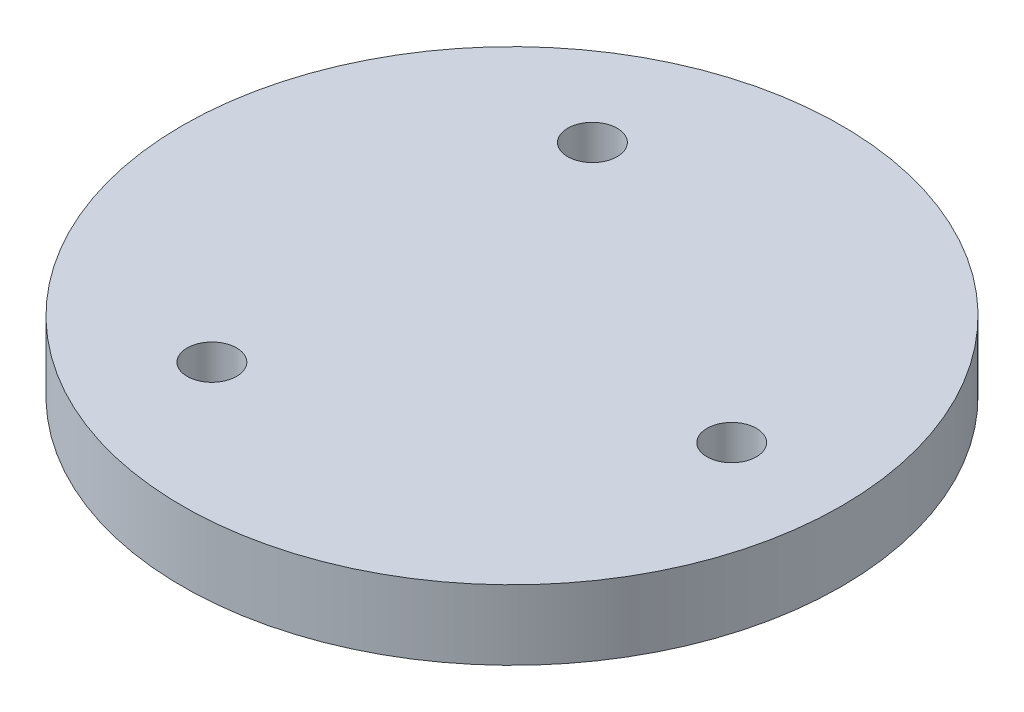
ISO-10303-21;
HEADER;
FILE_DESCRIPTION(('STEP AP214'),'2;1');
FILE_NAME('part.step','',(''),(''),'','','');
FILE_SCHEMA(('AUTOMOTIVE_DESIGN { 1 0 10303 214 1 1 1 1 }'));
ENDSEC;
DATA;
#1=APPLICATION_CONTEXT('core data for automotive mechanical design processes');
#2=APPLICATION_PROTOCOL_DEFINITION('international standard','automotive_design',2000,#1);
#3=PRODUCT_CONTEXT('',#1,'mechanical');
#4=PRODUCT('Part','Part','',(#3));
#5=PRODUCT_RELATED_PRODUCT_CATEGORY('part','',(#4));
#6=PRODUCT_DEFINITION_FORMATION('','',#4);
#7=PRODUCT_DEFINITION_CONTEXT('part definition',#1,'design');
#8=PRODUCT_DEFINITION('design','',#6,#7);
#9=PRODUCT_DEFINITION_SHAPE('','',#8);
#10=(LENGTH_UNIT() NAMED_UNIT(*) SI_UNIT(.MILLI.,.METRE.));
#11=(NAMED_UNIT(*) PLANE_ANGLE_UNIT() SI_UNIT($,.RADIAN.));
#12=(NAMED_UNIT(*) SI_UNIT($,.STERADIAN.) SOLID_ANGLE_UNIT());
#13=UNCERTAINTY_MEASURE_WITH_UNIT(LENGTH_MEASURE(1.E-05),#10,'distance_accuracy_value','');
#14=(GEOMETRIC_REPRESENTATION_CONTEXT(3) GLOBAL_UNCERTAINTY_ASSIGNED_CONTEXT((#13)) GLOBAL_UNIT_ASSIGNED_CONTEXT((#10,
#11,#12)) REPRESENTATION_CONTEXT('',''));
#15=CARTESIAN_POINT('',(0.,0.,0.));
#16=DIRECTION('',(0.,0.,1.));
#17=DIRECTION('',(1.,0.,0.));
#18=AXIS2_PLACEMENT_3D('',#15,#16,#17);
#19=CARTESIAN_POINT('',(0.,3.175,0.));
#20=DIRECTION('',(0.,-1.,0.));
#21=DIRECTION('',(1.,0.,0.));
#22=AXIS2_PLACEMENT_3D('',#19,#20,#21);
#23=PLANE('',#22);
#24=CARTESIAN_POINT('',(20.,3.175,0.));
#25=DIRECTION('',(0.,-1.,0.));
#26=DIRECTION('',(1.,0.,0.));
#27=AXIS2_PLACEMENT_3D('',#24,#25,#26);
#28=CIRCLE('',#27,2.25);
#29=CARTESIAN_POINT('',(22.25,3.175,0.));
#30=VERTEX_POINT('',#29);
#31=EDGE_CURVE('E58',#30,#30,#28,.T.);
#32=ORIENTED_EDGE('',*,*,#31,.T.);
#33=EDGE_LOOP('',(#32));
#34=FACE_BOUND('',#33,.T.);
#35=CARTESIAN_POINT('',(-9.99999999999996,3.175,17.3205080756888));
#36=DIRECTION('',(0.,-1.,0.));
#37=DIRECTION('',(1.,0.,0.));
#38=AXIS2_PLACEMENT_3D('',#35,#36,#37);
#39=CIRCLE('',#38,2.25);
#40=CARTESIAN_POINT('',(-7.74999999999996,3.175,17.3205080756888));
#41=VERTEX_POINT('',#40);
#42=EDGE_CURVE('E52',#41,#41,#39,.T.);
#43=ORIENTED_EDGE('',*,*,#42,.T.);
#44=EDGE_LOOP('',(#43));
#45=FACE_BOUND('',#44,.T.);
#46=CARTESIAN_POINT('',(-9.99999999999996,3.175,-17.3205080756888));
#47=DIRECTION('',(0.,-1.,0.));
#48=DIRECTION('',(1.,0.,0.));
#49=AXIS2_PLACEMENT_3D('',#46,#47,#48);
#50=CIRCLE('',#49,2.25);
#51=CARTESIAN_POINT('',(-7.74999999999996,3.175,-17.3205080756888));
#52=VERTEX_POINT('',#51);
#53=EDGE_CURVE('E43',#52,#52,#50,.T.);
#54=ORIENTED_EDGE('',*,*,#53,.T.);
#55=EDGE_LOOP('',(#54));
#56=FACE_BOUND('',#55,.T.);
#57=CARTESIAN_POINT('',(0.,3.175,0.));
#58=DIRECTION('',(0.,-1.,0.));
#59=DIRECTION('',(1.,0.,0.));
#60=AXIS2_PLACEMENT_3D('',#57,#58,#59);
#61=CIRCLE('',#60,30.);
#62=CARTESIAN_POINT('',(30.,3.175,0.));
#63=VERTEX_POINT('',#62);
#64=EDGE_CURVE('E10',#63,#63,#61,.T.);
#65=ORIENTED_EDGE('',*,*,#64,.F.);
#66=EDGE_LOOP('',(#65));
#67=FACE_BOUND('',#66,.T.);
#68=ADVANCED_FACE('F33',(#34,#45,#56,#67),#23,.F.);
#69=CARTESIAN_POINT('',(0.,-3.175,0.));
#70=DIRECTION('',(0.,-1.,0.));
#71=DIRECTION('',(1.,0.,0.));
#72=AXIS2_PLACEMENT_3D('',#69,#70,#71);
#73=CYLINDRICAL_SURFACE('',#72,30.);
#74=CARTESIAN_POINT('',(0.,-3.175,0.));
#75=DIRECTION('',(0.,-1.,0.));
#76=DIRECTION('',(1.,0.,0.));
#77=AXIS2_PLACEMENT_3D('',#74,#75,#76);
#78=CIRCLE('',#77,30.);
#79=CARTESIAN_POINT('',(30.,-3.175,0.));
#80=VERTEX_POINT('',#79);
#81=EDGE_CURVE('E39',#80,#80,#78,.T.);
#82=ORIENTED_EDGE('',*,*,#81,.F.);
#83=EDGE_LOOP('',(#82));
#84=FACE_BOUND('',#83,.T.);
#85=ORIENTED_EDGE('',*,*,#64,.T.);
#86=EDGE_LOOP('',(#85));
#87=FACE_BOUND('',#86,.T.);
#88=ADVANCED_FACE('F72',(#84,#87),#73,.T.);
#89=CARTESIAN_POINT('',(-30.,-3.175,0.));
#90=DIRECTION('',(0.,1.,0.));
#91=DIRECTION('',(-1.,0.,0.));
#92=AXIS2_PLACEMENT_3D('',#89,#90,#91);
#93=PLANE('',#92);
#94=CARTESIAN_POINT('',(20.,-3.175,0.));
#95=DIRECTION('',(0.,-1.,0.));
#96=DIRECTION('',(0.,0.,-1.));
#97=AXIS2_PLACEMENT_3D('',#94,#95,#96);
#98=CIRCLE('',#97,2.25);
#99=CARTESIAN_POINT('',(20.,-3.175,-2.25));
#100=VERTEX_POINT('',#99);
#101=EDGE_CURVE('E61',#100,#100,#98,.T.);
#102=ORIENTED_EDGE('',*,*,#101,.F.);
#103=EDGE_LOOP('',(#102));
#104=FACE_BOUND('',#103,.T.);
#105=CARTESIAN_POINT('',(-9.99999999999996,-3.175,17.3205080756888));
#106=DIRECTION('',(0.,-1.,0.));
#107=DIRECTION('',(0.,0.,-1.));
#108=AXIS2_PLACEMENT_3D('',#105,#106,#107);
#109=CIRCLE('',#108,2.25);
#110=CARTESIAN_POINT('',(-9.99999999999996,-3.175,15.0705080756888));
#111=VERTEX_POINT('',#110);
#112=EDGE_CURVE('E55',#111,#111,#109,.T.);
#113=ORIENTED_EDGE('',*,*,#112,.F.);
#114=EDGE_LOOP('',(#113));
#115=FACE_BOUND('',#114,.T.);
#116=CARTESIAN_POINT('',(-9.99999999999996,-3.175,-17.3205080756888));
#117=DIRECTION('',(0.,-1.,0.));
#118=DIRECTION('',(0.,0.,-1.));
#119=AXIS2_PLACEMENT_3D('',#116,#117,#118);
#120=CIRCLE('',#119,2.25);
#121=CARTESIAN_POINT('',(-9.99999999999996,-3.175,-19.5705080756888));
#122=VERTEX_POINT('',#121);
#123=EDGE_CURVE('E47',#122,#122,#120,.T.);
#124=ORIENTED_EDGE('',*,*,#123,.F.);
#125=EDGE_LOOP('',(#124));
#126=FACE_BOUND('',#125,.T.);
#127=ORIENTED_EDGE('',*,*,#81,.T.);
#128=EDGE_LOOP('',(#127));
#129=FACE_BOUND('',#128,.T.);
#130=ADVANCED_FACE('F68',(#104,#115,#126,#129),#93,.F.);
#131=CARTESIAN_POINT('',(-9.99999999999996,-3.175,-17.3205080756888));
#132=DIRECTION('',(0.,-1.,0.));
#133=DIRECTION('',(0.,0.,-1.));
#134=AXIS2_PLACEMENT_3D('',#131,#132,#133);
#135=CYLINDRICAL_SURFACE('',#134,2.25);
#136=ORIENTED_EDGE('',*,*,#123,.T.);
#137=EDGE_LOOP('',(#136));
#138=FACE_BOUND('',#137,.T.);
#139=ORIENTED_EDGE('',*,*,#53,.F.);
#140=EDGE_LOOP('',(#139));
#141=FACE_BOUND('',#140,.T.);
#142=ADVANCED_FACE('F71',(#138,#141),#135,.F.);
#143=CARTESIAN_POINT('',(-9.99999999999996,-3.175,17.3205080756888));
#144=DIRECTION('',(0.,-1.,0.));
#145=DIRECTION('',(0.,0.,-1.));
#146=AXIS2_PLACEMENT_3D('',#143,#144,#145);
#147=CYLINDRICAL_SURFACE('',#146,2.25);
#148=ORIENTED_EDGE('',*,*,#112,.T.);
#149=EDGE_LOOP('',(#148));
#150=FACE_BOUND('',#149,.T.);
#151=ORIENTED_EDGE('',*,*,#42,.F.);
#152=EDGE_LOOP('',(#151));
#153=FACE_BOUND('',#152,.T.);
#154=ADVANCED_FACE('F80',(#150,#153),#147,.F.);
#155=CARTESIAN_POINT('',(20.,-3.175,0.));
#156=DIRECTION('',(0.,-1.,0.));
#157=DIRECTION('',(0.,0.,-1.));
#158=AXIS2_PLACEMENT_3D('',#155,#156,#157);
#159=CYLINDRICAL_SURFACE('',#158,2.25);
#160=ORIENTED_EDGE('',*,*,#101,.T.);
#161=EDGE_LOOP('',(#160));
#162=FACE_BOUND('',#161,.T.);
#163=ORIENTED_EDGE('',*,*,#31,.F.);
#164=EDGE_LOOP('',(#163));
#165=FACE_BOUND('',#164,.T.);
#166=ADVANCED_FACE('F65',(#162,#165),#159,.F.);
#167=CLOSED_SHELL('',(#68,#88,#130,#142,#154,#166));
#168=MANIFOLD_SOLID_BREP('B2',#167);
#169=ADVANCED_BREP_SHAPE_REPRESENTATION('',(#18,#168),#14);
#170=SHAPE_DEFINITION_REPRESENTATION(#9,#169);
ENDSEC;
END-ISO-10303-21;
